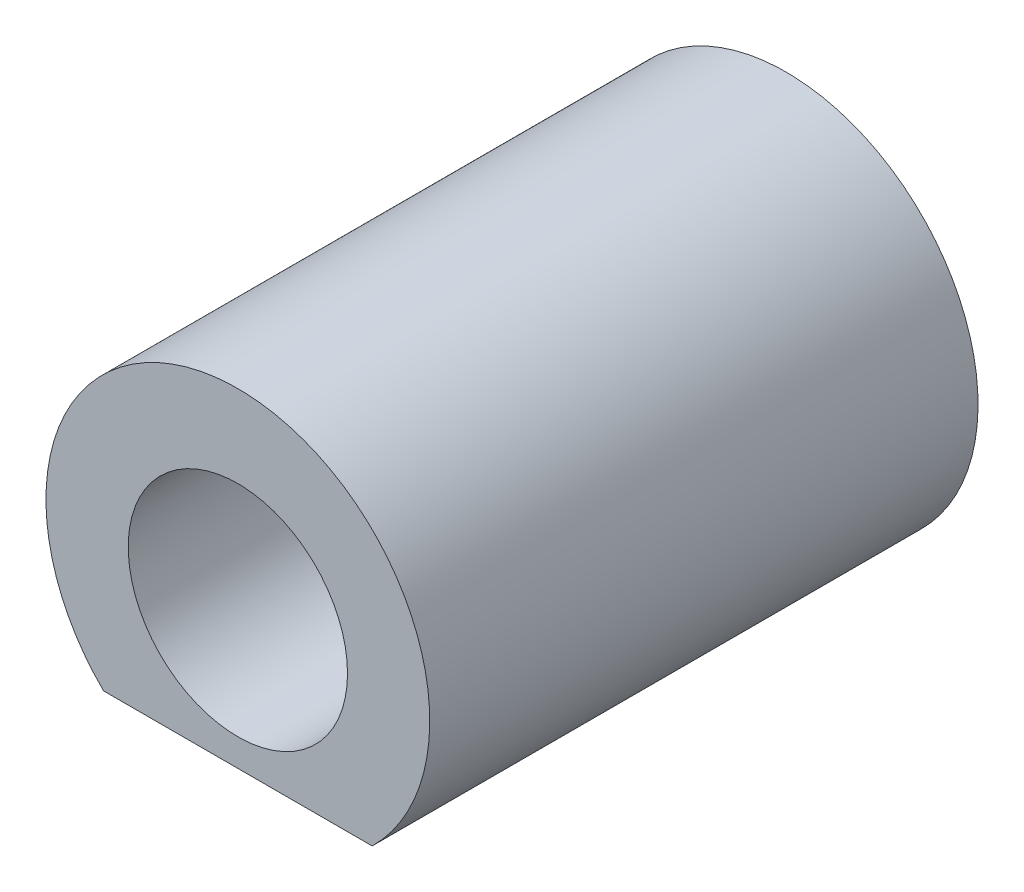
ISO-10303-21;
HEADER;
FILE_DESCRIPTION(('STEP AP214'),'2;1');
FILE_NAME('part.step','',(''),(''),'','','');
FILE_SCHEMA(('AUTOMOTIVE_DESIGN { 1 0 10303 214 1 1 1 1 }'));
ENDSEC;
DATA;
#1=APPLICATION_CONTEXT('core data for automotive mechanical design processes');
#2=APPLICATION_PROTOCOL_DEFINITION('international standard','automotive_design',2000,#1);
#3=PRODUCT_CONTEXT('',#1,'mechanical');
#4=PRODUCT('Part','Part','',(#3));
#5=PRODUCT_RELATED_PRODUCT_CATEGORY('part','',(#4));
#6=PRODUCT_DEFINITION_FORMATION('','',#4);
#7=PRODUCT_DEFINITION_CONTEXT('part definition',#1,'design');
#8=PRODUCT_DEFINITION('design','',#6,#7);
#9=PRODUCT_DEFINITION_SHAPE('','',#8);
#10=(LENGTH_UNIT() NAMED_UNIT(*) SI_UNIT(.MILLI.,.METRE.));
#11=(NAMED_UNIT(*) PLANE_ANGLE_UNIT() SI_UNIT($,.RADIAN.));
#12=(NAMED_UNIT(*) SI_UNIT($,.STERADIAN.) SOLID_ANGLE_UNIT());
#13=UNCERTAINTY_MEASURE_WITH_UNIT(LENGTH_MEASURE(1.E-05),#10,'distance_accuracy_value','');
#14=(GEOMETRIC_REPRESENTATION_CONTEXT(3) GLOBAL_UNCERTAINTY_ASSIGNED_CONTEXT((#13)) GLOBAL_UNIT_ASSIGNED_CONTEXT((#10,
#11,#12)) REPRESENTATION_CONTEXT('',''));
#15=CARTESIAN_POINT('',(0.,0.,0.));
#16=DIRECTION('',(0.,0.,1.));
#17=DIRECTION('',(1.,0.,0.));
#18=AXIS2_PLACEMENT_3D('',#15,#16,#17);
#19=CARTESIAN_POINT('',(4.89897948556636,-5.,-38.4390889145858));
#20=DIRECTION('',(0.,-1.,0.));
#21=DIRECTION('',(0.,0.,-1.));
#22=AXIS2_PLACEMENT_3D('',#19,#20,#21);
#23=PLANE('',#22);
#24=DIRECTION('',(-1.,0.,0.));
#25=VECTOR('',#24,1.);
#26=CARTESIAN_POINT('',(4.89897948556635,-5.,-20.));
#27=LINE('',#26,#25);
#28=CARTESIAN_POINT('',(4.89897948556636,-5.,-20.));
#29=VERTEX_POINT('',#28);
#30=CARTESIAN_POINT('',(-4.89897948556636,-5.,-20.));
#31=VERTEX_POINT('',#30);
#32=EDGE_CURVE('E41',#29,#31,#27,.T.);
#33=ORIENTED_EDGE('',*,*,#32,.F.);
#34=DIRECTION('',(0.,0.,1.));
#35=VECTOR('',#34,1.);
#36=CARTESIAN_POINT('',(4.89897948556636,-5.,-38.4390889145858));
#37=LINE('',#36,#35);
#38=CARTESIAN_POINT('',(4.89897948556636,-5.,0.));
#39=VERTEX_POINT('',#38);
#40=EDGE_CURVE('E65',#29,#39,#37,.T.);
#41=ORIENTED_EDGE('',*,*,#40,.T.);
#42=DIRECTION('',(1.,0.,0.));
#43=VECTOR('',#42,1.);
#44=CARTESIAN_POINT('',(4.89897948556636,-5.,0.));
#45=LINE('',#44,#43);
#46=CARTESIAN_POINT('',(-4.89897948556636,-5.,0.));
#47=VERTEX_POINT('',#46);
#48=EDGE_CURVE('E66',#47,#39,#45,.T.);
#49=ORIENTED_EDGE('',*,*,#48,.F.);
#50=DIRECTION('',(0.,0.,1.));
#51=VECTOR('',#50,1.);
#52=CARTESIAN_POINT('',(-4.89897948556636,-5.,-38.4390889145858));
#53=LINE('',#52,#51);
#54=EDGE_CURVE('E59',#31,#47,#53,.T.);
#55=ORIENTED_EDGE('',*,*,#54,.F.);
#56=EDGE_LOOP('',(#33,#41,#49,#55));
#57=FACE_BOUND('',#56,.T.);
#58=ADVANCED_FACE('F33',(#57),#23,.T.);
#59=CARTESIAN_POINT('',(0.,0.,-38.4390889145858));
#60=DIRECTION('',(0.,0.,1.));
#61=DIRECTION('',(1.,0.,0.));
#62=AXIS2_PLACEMENT_3D('',#59,#60,#61);
#63=CYLINDRICAL_SURFACE('',#62,7.);
#64=CARTESIAN_POINT('',(0.,0.,-20.));
#65=DIRECTION('',(0.,0.,1.));
#66=DIRECTION('',(1.,0.,0.));
#67=AXIS2_PLACEMENT_3D('',#64,#65,#66);
#68=CIRCLE('',#67,7.);
#69=EDGE_CURVE('E49',#31,#29,#68,.F.);
#70=ORIENTED_EDGE('',*,*,#69,.F.);
#71=ORIENTED_EDGE('',*,*,#54,.T.);
#72=CARTESIAN_POINT('',(0.,0.,0.));
#73=DIRECTION('',(0.,0.,1.));
#74=DIRECTION('',(1.,0.,0.));
#75=AXIS2_PLACEMENT_3D('',#72,#73,#74);
#76=CIRCLE('',#75,7.);
#77=EDGE_CURVE('E61',#39,#47,#76,.T.);
#78=ORIENTED_EDGE('',*,*,#77,.F.);
#79=ORIENTED_EDGE('',*,*,#40,.F.);
#80=EDGE_LOOP('',(#70,#71,#78,#79));
#81=FACE_BOUND('',#80,.T.);
#82=ADVANCED_FACE('F35',(#81),#63,.T.);
#83=CARTESIAN_POINT('',(0.,0.,0.));
#84=DIRECTION('',(0.,0.,1.));
#85=DIRECTION('',(1.,0.,0.));
#86=AXIS2_PLACEMENT_3D('',#83,#84,#85);
#87=PLANE('',#86);
#88=CARTESIAN_POINT('',(0.,0.,0.));
#89=DIRECTION('',(0.,0.,1.));
#90=DIRECTION('',(1.,0.,0.));
#91=AXIS2_PLACEMENT_3D('',#88,#89,#90);
#92=CIRCLE('',#91,4.);
#93=CARTESIAN_POINT('',(4.,0.,0.));
#94=VERTEX_POINT('',#93);
#95=EDGE_CURVE('E69',#94,#94,#92,.T.);
#96=ORIENTED_EDGE('',*,*,#95,.F.);
#97=EDGE_LOOP('',(#96));
#98=FACE_BOUND('',#97,.T.);
#99=ORIENTED_EDGE('',*,*,#77,.T.);
#100=ORIENTED_EDGE('',*,*,#48,.T.);
#101=EDGE_LOOP('',(#99,#100));
#102=FACE_BOUND('',#101,.T.);
#103=ADVANCED_FACE('F68',(#98,#102),#87,.T.);
#104=CARTESIAN_POINT('',(0.,0.,-38.4390889145858));
#105=DIRECTION('',(0.,0.,1.));
#106=DIRECTION('',(1.,0.,0.));
#107=AXIS2_PLACEMENT_3D('',#104,#105,#106);
#108=CYLINDRICAL_SURFACE('',#107,4.);
#109=CARTESIAN_POINT('',(0.,0.,-20.));
#110=DIRECTION('',(0.,0.,1.));
#111=DIRECTION('',(1.,0.,0.));
#112=AXIS2_PLACEMENT_3D('',#109,#110,#111);
#113=CIRCLE('',#112,4.);
#114=CARTESIAN_POINT('',(4.,0.,-20.));
#115=VERTEX_POINT('',#114);
#116=EDGE_CURVE('E11',#115,#115,#113,.F.);
#117=ORIENTED_EDGE('',*,*,#116,.T.);
#118=EDGE_LOOP('',(#117));
#119=FACE_BOUND('',#118,.T.);
#120=ORIENTED_EDGE('',*,*,#95,.T.);
#121=EDGE_LOOP('',(#120));
#122=FACE_BOUND('',#121,.T.);
#123=ADVANCED_FACE('F79',(#119,#122),#108,.F.);
#124=CARTESIAN_POINT('',(0.,0.,-20.));
#125=DIRECTION('',(0.,0.,1.));
#126=DIRECTION('',(0.107402551255347,-0.994215616445368,0.));
#127=AXIS2_PLACEMENT_3D('',#124,#125,#126);
#128=PLANE('',#127);
#129=ORIENTED_EDGE('',*,*,#69,.T.);
#130=ORIENTED_EDGE('',*,*,#32,.T.);
#131=EDGE_LOOP('',(#129,#130));
#132=FACE_BOUND('',#131,.T.);
#133=ORIENTED_EDGE('',*,*,#116,.F.);
#134=EDGE_LOOP('',(#133));
#135=FACE_BOUND('',#134,.T.);
#136=ADVANCED_FACE('F87',(#132,#135),#128,.F.);
#137=CLOSED_SHELL('',(#58,#82,#103,#123,#136));
#138=MANIFOLD_SOLID_BREP('B2',#137);
#139=ADVANCED_BREP_SHAPE_REPRESENTATION('',(#18,#138),#14);
#140=SHAPE_DEFINITION_REPRESENTATION(#9,#139);
ENDSEC;
END-ISO-10303-21;
